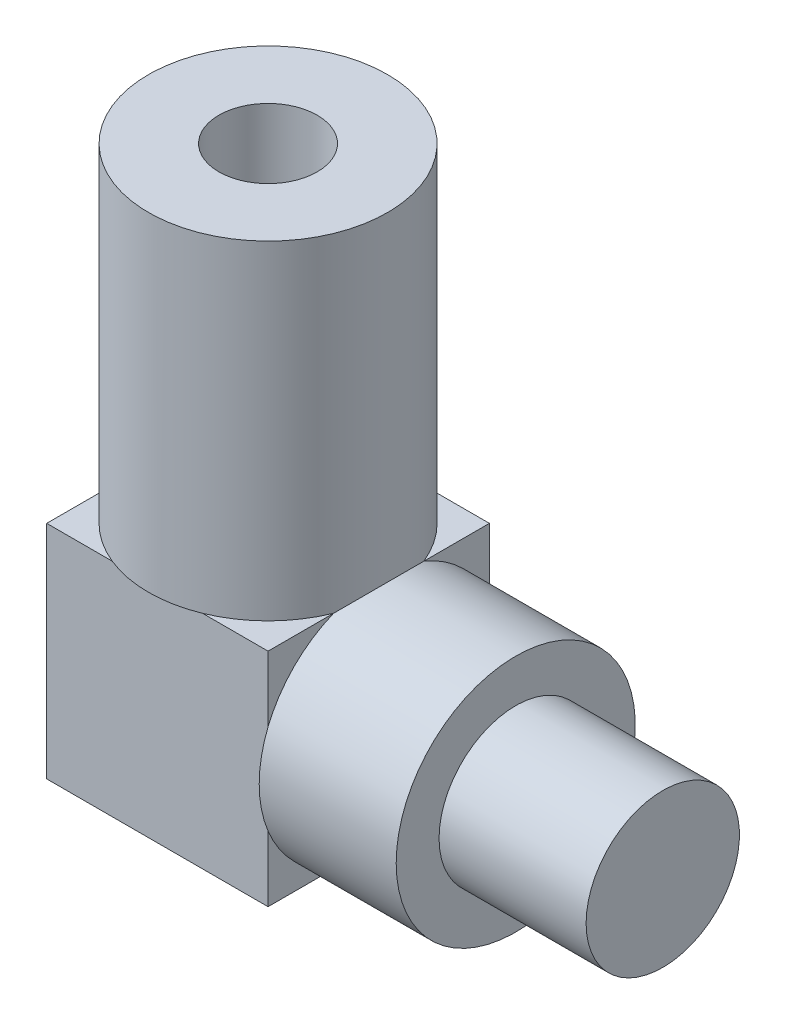
ISO-10303-21;
HEADER;
FILE_DESCRIPTION(('STEP AP214'),'2;1');
FILE_NAME('part.step','',(''),(''),'','','');
FILE_SCHEMA(('AUTOMOTIVE_DESIGN { 1 0 10303 214 1 1 1 1 }'));
ENDSEC;
DATA;
#1=APPLICATION_CONTEXT('core data for automotive mechanical design processes');
#2=APPLICATION_PROTOCOL_DEFINITION('international standard','automotive_design',2000,#1);
#3=PRODUCT_CONTEXT('',#1,'mechanical');
#4=PRODUCT('Part','Part','',(#3));
#5=PRODUCT_RELATED_PRODUCT_CATEGORY('part','',(#4));
#6=PRODUCT_DEFINITION_FORMATION('','',#4);
#7=PRODUCT_DEFINITION_CONTEXT('part definition',#1,'design');
#8=PRODUCT_DEFINITION('design','',#6,#7);
#9=PRODUCT_DEFINITION_SHAPE('','',#8);
#10=(LENGTH_UNIT() NAMED_UNIT(*) SI_UNIT(.MILLI.,.METRE.));
#11=(NAMED_UNIT(*) PLANE_ANGLE_UNIT() SI_UNIT($,.RADIAN.));
#12=(NAMED_UNIT(*) SI_UNIT($,.STERADIAN.) SOLID_ANGLE_UNIT());
#13=UNCERTAINTY_MEASURE_WITH_UNIT(LENGTH_MEASURE(1.E-05),#10,'distance_accuracy_value','');
#14=(GEOMETRIC_REPRESENTATION_CONTEXT(3) GLOBAL_UNCERTAINTY_ASSIGNED_CONTEXT((#13)) GLOBAL_UNIT_ASSIGNED_CONTEXT((#10,
#11,#12)) REPRESENTATION_CONTEXT('',''));
#15=CARTESIAN_POINT('',(0.,0.,0.));
#16=DIRECTION('',(0.,0.,1.));
#17=DIRECTION('',(1.,0.,0.));
#18=AXIS2_PLACEMENT_3D('',#15,#16,#17);
#19=CARTESIAN_POINT('',(-8.85,7.15,7.15));
#20=DIRECTION('',(0.,-1.,0.));
#21=DIRECTION('',(0.,0.,-1.));
#22=AXIS2_PLACEMENT_3D('',#19,#20,#21);
#23=PLANE('',#22);
#24=DIRECTION('',(-1.,0.,0.));
#25=VECTOR('',#24,1.);
#26=CARTESIAN_POINT('',(-8.85,7.15,-7.15));
#27=LINE('',#26,#25);
#28=CARTESIAN_POINT('',(-8.85,7.15,-7.15));
#29=VERTEX_POINT('',#28);
#30=CARTESIAN_POINT('',(-13.0833608382249,7.15,-7.15));
#31=VERTEX_POINT('',#30);
#32=EDGE_CURVE('E157',#29,#31,#27,.T.);
#33=ORIENTED_EDGE('',*,*,#32,.T.);
#34=CARTESIAN_POINT('',(-16.,7.15,0.));
#35=DIRECTION('',(0.,-1.,0.));
#36=DIRECTION('',(0.,0.,-1.));
#37=AXIS2_PLACEMENT_3D('',#34,#35,#36);
#38=CIRCLE('',#37,7.722);
#39=CARTESIAN_POINT('',(-8.85000000000001,7.15,-2.91663916177508));
#40=VERTEX_POINT('',#39);
#41=EDGE_CURVE('E148',#31,#40,#38,.T.);
#42=ORIENTED_EDGE('',*,*,#41,.T.);
#43=DIRECTION('',(0.,0.,-1.));
#44=VECTOR('',#43,1.);
#45=CARTESIAN_POINT('',(-8.85,7.15,7.15));
#46=LINE('',#45,#44);
#47=EDGE_CURVE('E163',#40,#29,#46,.T.);
#48=ORIENTED_EDGE('',*,*,#47,.T.);
#49=EDGE_LOOP('',(#33,#42,#48));
#50=FACE_BOUND('',#49,.T.);
#51=ADVANCED_FACE('F41',(#50),#23,.F.);
#52=CARTESIAN_POINT('',(-8.85,7.15,7.15));
#53=VERTEX_POINT('',#52);
#54=CARTESIAN_POINT('',(-8.85000000000002,7.15,2.91663916177508));
#55=VERTEX_POINT('',#54);
#56=EDGE_CURVE('E178',#53,#55,#46,.T.);
#57=ORIENTED_EDGE('',*,*,#56,.T.);
#58=CARTESIAN_POINT('',(-13.0833608382249,7.15,7.15));
#59=VERTEX_POINT('',#58);
#60=EDGE_CURVE('E155',#55,#59,#38,.T.);
#61=ORIENTED_EDGE('',*,*,#60,.T.);
#62=DIRECTION('',(-1.,0.,0.));
#63=VECTOR('',#62,1.);
#64=CARTESIAN_POINT('',(-8.85,7.15,7.15));
#65=LINE('',#64,#63);
#66=EDGE_CURVE('E273',#53,#59,#65,.T.);
#67=ORIENTED_EDGE('',*,*,#66,.F.);
#68=EDGE_LOOP('',(#57,#61,#67));
#69=FACE_BOUND('',#68,.T.);
#70=ADVANCED_FACE('F243',(#69),#23,.F.);
#71=CARTESIAN_POINT('',(-18.9166391617751,7.15,7.15));
#72=VERTEX_POINT('',#71);
#73=CARTESIAN_POINT('',(-23.15,7.15,7.15));
#74=VERTEX_POINT('',#73);
#75=EDGE_CURVE('E68',#72,#74,#65,.T.);
#76=ORIENTED_EDGE('',*,*,#75,.F.);
#77=CARTESIAN_POINT('',(-23.15,7.15,2.91663916177509));
#78=VERTEX_POINT('',#77);
#79=EDGE_CURVE('E275',#72,#78,#38,.T.);
#80=ORIENTED_EDGE('',*,*,#79,.T.);
#81=DIRECTION('',(0.,0.,-1.));
#82=VECTOR('',#81,1.);
#83=CARTESIAN_POINT('',(-23.15,7.15,7.15));
#84=LINE('',#83,#82);
#85=EDGE_CURVE('E171',#74,#78,#84,.T.);
#86=ORIENTED_EDGE('',*,*,#85,.F.);
#87=EDGE_LOOP('',(#76,#80,#86));
#88=FACE_BOUND('',#87,.T.);
#89=ADVANCED_FACE('F246',(#88),#23,.F.);
#90=CARTESIAN_POINT('',(-8.85,-7.15,7.15));
#91=DIRECTION('',(-1.,0.,0.));
#92=DIRECTION('',(0.,0.,1.));
#93=AXIS2_PLACEMENT_3D('',#90,#91,#92);
#94=PLANE('',#93);
#95=DIRECTION('',(0.,1.,0.));
#96=VECTOR('',#95,1.);
#97=CARTESIAN_POINT('',(-8.85,-7.15,7.15));
#98=LINE('',#97,#96);
#99=CARTESIAN_POINT('',(-8.85000000000002,2.91663916177508,7.15));
#100=VERTEX_POINT('',#99);
#101=EDGE_CURVE('E284',#100,#53,#98,.T.);
#102=ORIENTED_EDGE('',*,*,#101,.F.);
#103=CARTESIAN_POINT('',(-8.85000000000002,0.,0.));
#104=DIRECTION('',(-1.,0.,0.));
#105=DIRECTION('',(0.,0.,1.));
#106=AXIS2_PLACEMENT_3D('',#103,#104,#105);
#107=CIRCLE('',#106,7.722);
#108=EDGE_CURVE('E193',#100,#55,#107,.T.);
#109=ORIENTED_EDGE('',*,*,#108,.T.);
#110=ORIENTED_EDGE('',*,*,#56,.F.);
#111=EDGE_LOOP('',(#102,#109,#110));
#112=FACE_BOUND('',#111,.T.);
#113=ADVANCED_FACE('F263',(#112),#94,.F.);
#114=ORIENTED_EDGE('',*,*,#47,.F.);
#115=CARTESIAN_POINT('',(-8.85000000000002,2.91663916177508,-7.15));
#116=VERTEX_POINT('',#115);
#117=EDGE_CURVE('E49',#40,#116,#107,.T.);
#118=ORIENTED_EDGE('',*,*,#117,.T.);
#119=DIRECTION('',(0.,1.,0.));
#120=VECTOR('',#119,1.);
#121=CARTESIAN_POINT('',(-8.85,-7.15,-7.15));
#122=LINE('',#121,#120);
#123=EDGE_CURVE('E291',#116,#29,#122,.T.);
#124=ORIENTED_EDGE('',*,*,#123,.T.);
#125=EDGE_LOOP('',(#114,#118,#124));
#126=FACE_BOUND('',#125,.T.);
#127=ADVANCED_FACE('F269',(#126),#94,.F.);
#128=CARTESIAN_POINT('',(-8.85,-7.15,-7.15));
#129=VERTEX_POINT('',#128);
#130=CARTESIAN_POINT('',(-8.85000000000002,-2.91663916177508,-7.15));
#131=VERTEX_POINT('',#130);
#132=EDGE_CURVE('E166',#129,#131,#122,.T.);
#133=ORIENTED_EDGE('',*,*,#132,.T.);
#134=CARTESIAN_POINT('',(-8.85000000000002,-7.15,-2.91663916177508));
#135=VERTEX_POINT('',#134);
#136=EDGE_CURVE('E189',#131,#135,#107,.T.);
#137=ORIENTED_EDGE('',*,*,#136,.T.);
#138=DIRECTION('',(0.,0.,-1.));
#139=VECTOR('',#138,1.);
#140=CARTESIAN_POINT('',(-8.85,-7.15,7.15));
#141=LINE('',#140,#139);
#142=EDGE_CURVE('E179',#135,#129,#141,.T.);
#143=ORIENTED_EDGE('',*,*,#142,.T.);
#144=EDGE_LOOP('',(#133,#137,#143));
#145=FACE_BOUND('',#144,.T.);
#146=ADVANCED_FACE('F262',(#145),#94,.F.);
#147=CARTESIAN_POINT('',(-23.15,7.15,7.15));
#148=DIRECTION('',(1.,0.,0.));
#149=DIRECTION('',(0.,0.,-1.));
#150=AXIS2_PLACEMENT_3D('',#147,#148,#149);
#151=PLANE('',#150);
#152=DIRECTION('',(0.,-1.,0.));
#153=VECTOR('',#152,1.);
#154=CARTESIAN_POINT('',(-23.15,7.15,-7.15));
#155=LINE('',#154,#153);
#156=CARTESIAN_POINT('',(-23.15,7.15,-7.15));
#157=VERTEX_POINT('',#156);
#158=CARTESIAN_POINT('',(-23.15,-7.15,-7.15));
#159=VERTEX_POINT('',#158);
#160=EDGE_CURVE('E287',#157,#159,#155,.T.);
#161=ORIENTED_EDGE('',*,*,#160,.T.);
#162=DIRECTION('',(0.,0.,-1.));
#163=VECTOR('',#162,1.);
#164=CARTESIAN_POINT('',(-23.15,-7.15,7.15));
#165=LINE('',#164,#163);
#166=CARTESIAN_POINT('',(-23.15,-7.15,7.15));
#167=VERTEX_POINT('',#166);
#168=EDGE_CURVE('E181',#167,#159,#165,.T.);
#169=ORIENTED_EDGE('',*,*,#168,.F.);
#170=DIRECTION('',(0.,-1.,0.));
#171=VECTOR('',#170,1.);
#172=CARTESIAN_POINT('',(-23.15,7.15,7.15));
#173=LINE('',#172,#171);
#174=EDGE_CURVE('E167',#74,#167,#173,.T.);
#175=ORIENTED_EDGE('',*,*,#174,.F.);
#176=ORIENTED_EDGE('',*,*,#85,.T.);
#177=DIRECTION('',(0.,0.,-1.));
#178=VECTOR('',#177,1.);
#179=CARTESIAN_POINT('',(-23.15,7.15,7.15));
#180=LINE('',#179,#178);
#181=CARTESIAN_POINT('',(-23.15,7.15,-2.91663916177509));
#182=VERTEX_POINT('',#181);
#183=EDGE_CURVE('E208',#78,#182,#180,.T.);
#184=ORIENTED_EDGE('',*,*,#183,.T.);
#185=EDGE_CURVE('E90',#182,#157,#84,.T.);
#186=ORIENTED_EDGE('',*,*,#185,.T.);
#187=EDGE_LOOP('',(#161,#169,#175,#176,#184,#186));
#188=FACE_BOUND('',#187,.T.);
#189=ADVANCED_FACE('F43',(#188),#151,.F.);
#190=CARTESIAN_POINT('',(-23.15,-7.15,7.15));
#191=DIRECTION('',(0.,1.,0.));
#192=DIRECTION('',(0.,0.,1.));
#193=AXIS2_PLACEMENT_3D('',#190,#191,#192);
#194=PLANE('',#193);
#195=DIRECTION('',(1.,0.,0.));
#196=VECTOR('',#195,1.);
#197=CARTESIAN_POINT('',(-23.15,-7.15,-7.15));
#198=LINE('',#197,#196);
#199=EDGE_CURVE('E292',#159,#129,#198,.T.);
#200=ORIENTED_EDGE('',*,*,#199,.T.);
#201=ORIENTED_EDGE('',*,*,#142,.F.);
#202=CARTESIAN_POINT('',(-8.85000000000002,-7.15,2.91663916177508));
#203=VERTEX_POINT('',#202);
#204=EDGE_CURVE('E184',#203,#135,#141,.T.);
#205=ORIENTED_EDGE('',*,*,#204,.F.);
#206=CARTESIAN_POINT('',(-8.85,-7.15,7.15));
#207=VERTEX_POINT('',#206);
#208=EDGE_CURVE('E177',#207,#203,#141,.T.);
#209=ORIENTED_EDGE('',*,*,#208,.F.);
#210=DIRECTION('',(1.,0.,0.));
#211=VECTOR('',#210,1.);
#212=CARTESIAN_POINT('',(-23.15,-7.15,7.15));
#213=LINE('',#212,#211);
#214=EDGE_CURVE('E100',#167,#207,#213,.T.);
#215=ORIENTED_EDGE('',*,*,#214,.F.);
#216=ORIENTED_EDGE('',*,*,#168,.T.);
#217=EDGE_LOOP('',(#200,#201,#205,#209,#215,#216));
#218=FACE_BOUND('',#217,.T.);
#219=ADVANCED_FACE('F265',(#218),#194,.F.);
#220=ORIENTED_EDGE('',*,*,#208,.T.);
#221=CARTESIAN_POINT('',(-8.85000000000002,-2.91663916177508,7.15));
#222=VERTEX_POINT('',#221);
#223=EDGE_CURVE('E183',#203,#222,#107,.T.);
#224=ORIENTED_EDGE('',*,*,#223,.T.);
#225=EDGE_CURVE('E274',#207,#222,#98,.T.);
#226=ORIENTED_EDGE('',*,*,#225,.F.);
#227=EDGE_LOOP('',(#220,#224,#226));
#228=FACE_BOUND('',#227,.T.);
#229=ADVANCED_FACE('F255',(#228),#94,.F.);
#230=ORIENTED_EDGE('',*,*,#185,.F.);
#231=CARTESIAN_POINT('',(-18.9166391617751,7.15,-7.15));
#232=VERTEX_POINT('',#231);
#233=EDGE_CURVE('E141',#182,#232,#38,.T.);
#234=ORIENTED_EDGE('',*,*,#233,.T.);
#235=EDGE_CURVE('E159',#232,#157,#27,.T.);
#236=ORIENTED_EDGE('',*,*,#235,.T.);
#237=EDGE_LOOP('',(#230,#234,#236));
#238=FACE_BOUND('',#237,.T.);
#239=ADVANCED_FACE('F241',(#238),#23,.F.);
#240=CARTESIAN_POINT('',(0.,0.,7.15));
#241=DIRECTION('',(0.,0.,1.));
#242=DIRECTION('',(1.,0.,0.));
#243=AXIS2_PLACEMENT_3D('',#240,#241,#242);
#244=PLANE('',#243);
#245=ORIENTED_EDGE('',*,*,#174,.T.);
#246=ORIENTED_EDGE('',*,*,#214,.T.);
#247=ORIENTED_EDGE('',*,*,#225,.T.);
#248=EDGE_CURVE('E288',#222,#100,#98,.T.);
#249=ORIENTED_EDGE('',*,*,#248,.T.);
#250=ORIENTED_EDGE('',*,*,#101,.T.);
#251=ORIENTED_EDGE('',*,*,#66,.T.);
#252=DIRECTION('',(1.,0.,0.));
#253=VECTOR('',#252,1.);
#254=CARTESIAN_POINT('',(0.,7.15,7.15));
#255=LINE('',#254,#253);
#256=EDGE_CURVE('E161',#72,#59,#255,.T.);
#257=ORIENTED_EDGE('',*,*,#256,.F.);
#258=ORIENTED_EDGE('',*,*,#75,.T.);
#259=EDGE_LOOP('',(#245,#246,#247,#249,#250,#251,#257,#258));
#260=FACE_BOUND('',#259,.T.);
#261=ADVANCED_FACE('F251',(#260),#244,.T.);
#262=CARTESIAN_POINT('',(0.,0.,-7.15));
#263=DIRECTION('',(0.,0.,1.));
#264=DIRECTION('',(1.,0.,0.));
#265=AXIS2_PLACEMENT_3D('',#262,#263,#264);
#266=PLANE('',#265);
#267=ORIENTED_EDGE('',*,*,#160,.F.);
#268=ORIENTED_EDGE('',*,*,#235,.F.);
#269=DIRECTION('',(1.,0.,0.));
#270=VECTOR('',#269,1.);
#271=CARTESIAN_POINT('',(0.,7.15,-7.15));
#272=LINE('',#271,#270);
#273=EDGE_CURVE('E137',#232,#31,#272,.T.);
#274=ORIENTED_EDGE('',*,*,#273,.T.);
#275=ORIENTED_EDGE('',*,*,#32,.F.);
#276=ORIENTED_EDGE('',*,*,#123,.F.);
#277=EDGE_CURVE('E298',#131,#116,#122,.T.);
#278=ORIENTED_EDGE('',*,*,#277,.F.);
#279=ORIENTED_EDGE('',*,*,#132,.F.);
#280=ORIENTED_EDGE('',*,*,#199,.F.);
#281=EDGE_LOOP('',(#267,#268,#274,#275,#276,#278,#279,#280));
#282=FACE_BOUND('',#281,.T.);
#283=ADVANCED_FACE('F160',(#282),#266,.F.);
#284=CARTESIAN_POINT('',(-8.85,7.722,0.));
#285=DIRECTION('',(1.,0.,0.));
#286=DIRECTION('',(0.,0.,-1.));
#287=AXIS2_PLACEMENT_3D('',#284,#285,#286);
#288=PLANE('',#287);
#289=EDGE_CURVE('E199',#116,#131,#107,.T.);
#290=ORIENTED_EDGE('',*,*,#289,.T.);
#291=ORIENTED_EDGE('',*,*,#277,.T.);
#292=EDGE_LOOP('',(#290,#291));
#293=FACE_BOUND('',#292,.T.);
#294=ADVANCED_FACE('F304',(#293),#288,.F.);
#295=EDGE_CURVE('E210',#135,#203,#107,.T.);
#296=ORIENTED_EDGE('',*,*,#295,.T.);
#297=ORIENTED_EDGE('',*,*,#204,.T.);
#298=EDGE_LOOP('',(#296,#297));
#299=FACE_BOUND('',#298,.T.);
#300=ADVANCED_FACE('F317',(#299),#288,.F.);
#301=CARTESIAN_POINT('',(9.5,0.,0.));
#302=DIRECTION('',(-1.,0.,0.));
#303=DIRECTION('',(0.,0.,1.));
#304=AXIS2_PLACEMENT_3D('',#301,#302,#303);
#305=PLANE('',#304);
#306=CARTESIAN_POINT('',(9.50000000000006,0.,0.));
#307=DIRECTION('',(-1.,0.,0.));
#308=DIRECTION('',(0.,0.,1.));
#309=AXIS2_PLACEMENT_3D('',#306,#307,#308);
#310=CIRCLE('',#309,4.953);
#311=CARTESIAN_POINT('',(9.50000000000006,0.,4.953));
#312=VERTEX_POINT('',#311);
#313=EDGE_CURVE('E295',#312,#312,#310,.T.);
#314=ORIENTED_EDGE('',*,*,#313,.F.);
#315=EDGE_LOOP('',(#314));
#316=FACE_BOUND('',#315,.T.);
#317=ADVANCED_FACE('F321',(#316),#305,.F.);
#318=CARTESIAN_POINT('',(-1000.,0.,0.));
#319=DIRECTION('',(-1.,0.,0.));
#320=DIRECTION('',(0.,0.,1.));
#321=AXIS2_PLACEMENT_3D('',#318,#319,#320);
#322=CYLINDRICAL_SURFACE('',#321,4.953);
#323=CARTESIAN_POINT('',(0.,0.,0.));
#324=DIRECTION('',(-1.,0.,0.));
#325=DIRECTION('',(0.,0.,1.));
#326=AXIS2_PLACEMENT_3D('',#323,#324,#325);
#327=CIRCLE('',#326,4.953);
#328=CARTESIAN_POINT('',(0.,0.,4.953));
#329=VERTEX_POINT('',#328);
#330=EDGE_CURVE('E202',#329,#329,#327,.T.);
#331=ORIENTED_EDGE('',*,*,#330,.F.);
#332=EDGE_LOOP('',(#331));
#333=FACE_BOUND('',#332,.T.);
#334=ORIENTED_EDGE('',*,*,#313,.T.);
#335=EDGE_LOOP('',(#334));
#336=FACE_BOUND('',#335,.T.);
#337=ADVANCED_FACE('F327',(#333,#336),#322,.T.);
#338=CARTESIAN_POINT('',(0.,4.953,0.));
#339=DIRECTION('',(-1.,0.,0.));
#340=DIRECTION('',(0.,0.,1.));
#341=AXIS2_PLACEMENT_3D('',#338,#339,#340);
#342=PLANE('',#341);
#343=CARTESIAN_POINT('',(0.,0.,0.));
#344=DIRECTION('',(-1.,0.,0.));
#345=DIRECTION('',(0.,0.,1.));
#346=AXIS2_PLACEMENT_3D('',#343,#344,#345);
#347=CIRCLE('',#346,7.722);
#348=CARTESIAN_POINT('',(0.,0.,7.722));
#349=VERTEX_POINT('',#348);
#350=EDGE_CURVE('E200',#349,#349,#347,.T.);
#351=ORIENTED_EDGE('',*,*,#350,.F.);
#352=EDGE_LOOP('',(#351));
#353=FACE_BOUND('',#352,.T.);
#354=ORIENTED_EDGE('',*,*,#330,.T.);
#355=EDGE_LOOP('',(#354));
#356=FACE_BOUND('',#355,.T.);
#357=ADVANCED_FACE('F336',(#353,#356),#342,.F.);
#358=CARTESIAN_POINT('',(-1000.,0.,0.));
#359=DIRECTION('',(-1.,0.,0.));
#360=DIRECTION('',(0.,0.,1.));
#361=AXIS2_PLACEMENT_3D('',#358,#359,#360);
#362=CYLINDRICAL_SURFACE('',#361,7.722);
#363=ORIENTED_EDGE('',*,*,#117,.F.);
#364=CARTESIAN_POINT('',(-16.,0.,0.));
#365=DIRECTION('',(-0.707106781186547,0.707106781186547,0.));
#366=DIRECTION('',(-0.707106781186547,-0.707106781186547,0.));
#367=AXIS2_PLACEMENT_3D('',#364,#365,#366);
#368=ELLIPSE('',#367,10.920557128645,7.722);
#369=EDGE_CURVE('E11',#40,#55,#368,.F.);
#370=ORIENTED_EDGE('',*,*,#369,.T.);
#371=ORIENTED_EDGE('',*,*,#108,.F.);
#372=EDGE_CURVE('E60',#222,#100,#107,.T.);
#373=ORIENTED_EDGE('',*,*,#372,.F.);
#374=ORIENTED_EDGE('',*,*,#223,.F.);
#375=ORIENTED_EDGE('',*,*,#295,.F.);
#376=ORIENTED_EDGE('',*,*,#136,.F.);
#377=ORIENTED_EDGE('',*,*,#289,.F.);
#378=EDGE_LOOP('',(#363,#370,#371,#373,#374,#375,#376,#377));
#379=FACE_BOUND('',#378,.T.);
#380=ORIENTED_EDGE('',*,*,#350,.T.);
#381=EDGE_LOOP('',(#380));
#382=FACE_BOUND('',#381,.T.);
#383=ADVANCED_FACE('F302',(#379,#382),#362,.T.);
#384=ORIENTED_EDGE('',*,*,#248,.F.);
#385=ORIENTED_EDGE('',*,*,#372,.T.);
#386=EDGE_LOOP('',(#384,#385));
#387=FACE_BOUND('',#386,.T.);
#388=ADVANCED_FACE('F323',(#387),#288,.F.);
#389=CARTESIAN_POINT('',(-16.,7.15,0.));
#390=DIRECTION('',(0.,-1.,0.));
#391=DIRECTION('',(0.,0.,-1.));
#392=AXIS2_PLACEMENT_3D('',#389,#390,#391);
#393=PLANE('',#392);
#394=ORIENTED_EDGE('',*,*,#183,.F.);
#395=EDGE_CURVE('E496',#78,#182,#38,.T.);
#396=ORIENTED_EDGE('',*,*,#395,.T.);
#397=EDGE_LOOP('',(#394,#396));
#398=FACE_BOUND('',#397,.T.);
#399=ADVANCED_FACE('F239',(#398),#393,.T.);
#400=ORIENTED_EDGE('',*,*,#273,.F.);
#401=EDGE_CURVE('E138',#232,#31,#38,.T.);
#402=ORIENTED_EDGE('',*,*,#401,.T.);
#403=EDGE_LOOP('',(#400,#402));
#404=FACE_BOUND('',#403,.T.);
#405=ADVANCED_FACE('F136',(#404),#393,.T.);
#406=EDGE_CURVE('E283',#59,#72,#38,.T.);
#407=ORIENTED_EDGE('',*,*,#406,.T.);
#408=ORIENTED_EDGE('',*,*,#256,.T.);
#409=EDGE_LOOP('',(#407,#408));
#410=FACE_BOUND('',#409,.T.);
#411=ADVANCED_FACE('F235',(#410),#393,.T.);
#412=CARTESIAN_POINT('',(-16.,0.,0.));
#413=DIRECTION('',(0.,-1.,0.));
#414=DIRECTION('',(0.,0.,-1.));
#415=AXIS2_PLACEMENT_3D('',#412,#413,#414);
#416=CYLINDRICAL_SURFACE('',#415,7.722);
#417=CARTESIAN_POINT('',(-16.,28.4,0.));
#418=DIRECTION('',(0.,-1.,0.));
#419=DIRECTION('',(0.,0.,-1.));
#420=AXIS2_PLACEMENT_3D('',#417,#418,#419);
#421=CIRCLE('',#420,7.722);
#422=CARTESIAN_POINT('',(-16.,28.4,-7.722));
#423=VERTEX_POINT('',#422);
#424=EDGE_CURVE('E145',#423,#423,#421,.T.);
#425=ORIENTED_EDGE('',*,*,#424,.T.);
#426=EDGE_LOOP('',(#425));
#427=FACE_BOUND('',#426,.T.);
#428=ORIENTED_EDGE('',*,*,#369,.F.);
#429=ORIENTED_EDGE('',*,*,#41,.F.);
#430=ORIENTED_EDGE('',*,*,#401,.F.);
#431=ORIENTED_EDGE('',*,*,#233,.F.);
#432=ORIENTED_EDGE('',*,*,#395,.F.);
#433=ORIENTED_EDGE('',*,*,#79,.F.);
#434=ORIENTED_EDGE('',*,*,#406,.F.);
#435=ORIENTED_EDGE('',*,*,#60,.F.);
#436=EDGE_LOOP('',(#428,#429,#430,#431,#432,#433,#434,#435));
#437=FACE_BOUND('',#436,.T.);
#438=ADVANCED_FACE('F146',(#427,#437),#416,.T.);
#439=CARTESIAN_POINT('',(-8.278,28.4,0.));
#440=DIRECTION('',(0.,1.,0.));
#441=DIRECTION('',(0.,0.,1.));
#442=AXIS2_PLACEMENT_3D('',#439,#440,#441);
#443=PLANE('',#442);
#444=CARTESIAN_POINT('',(-16.,28.4,0.));
#445=DIRECTION('',(0.,1.,0.));
#446=DIRECTION('',(0.,0.,1.));
#447=AXIS2_PLACEMENT_3D('',#444,#445,#446);
#448=CIRCLE('',#447,3.175);
#449=CARTESIAN_POINT('',(-16.,28.4,3.175));
#450=VERTEX_POINT('',#449);
#451=EDGE_CURVE('E44',#450,#450,#448,.T.);
#452=ORIENTED_EDGE('',*,*,#451,.F.);
#453=EDGE_LOOP('',(#452));
#454=FACE_BOUND('',#453,.T.);
#455=ORIENTED_EDGE('',*,*,#424,.F.);
#456=EDGE_LOOP('',(#455));
#457=FACE_BOUND('',#456,.T.);
#458=ADVANCED_FACE('F221',(#454,#457),#443,.T.);
#459=CARTESIAN_POINT('',(-16.,13.2,0.));
#460=DIRECTION('',(0.,-1.,0.));
#461=DIRECTION('',(0.,0.,-1.));
#462=AXIS2_PLACEMENT_3D('',#459,#460,#461);
#463=PLANE('',#462);
#464=CARTESIAN_POINT('',(-16.,13.2,0.));
#465=DIRECTION('',(0.,-1.,0.));
#466=DIRECTION('',(0.,0.,-1.));
#467=AXIS2_PLACEMENT_3D('',#464,#465,#466);
#468=CIRCLE('',#467,3.175);
#469=CARTESIAN_POINT('',(-16.,13.2,-3.175));
#470=VERTEX_POINT('',#469);
#471=EDGE_CURVE('E214',#470,#470,#468,.T.);
#472=ORIENTED_EDGE('',*,*,#471,.F.);
#473=EDGE_LOOP('',(#472));
#474=FACE_BOUND('',#473,.T.);
#475=ADVANCED_FACE('F230',(#474),#463,.F.);
#476=CARTESIAN_POINT('',(-16.,0.,0.));
#477=DIRECTION('',(0.,-1.,0.));
#478=DIRECTION('',(0.,0.,-1.));
#479=AXIS2_PLACEMENT_3D('',#476,#477,#478);
#480=CYLINDRICAL_SURFACE('',#479,3.175);
#481=ORIENTED_EDGE('',*,*,#451,.T.);
#482=EDGE_LOOP('',(#481));
#483=FACE_BOUND('',#482,.T.);
#484=ORIENTED_EDGE('',*,*,#471,.T.);
#485=EDGE_LOOP('',(#484));
#486=FACE_BOUND('',#485,.T.);
#487=ADVANCED_FACE('F225',(#483,#486),#480,.F.);
#488=CLOSED_SHELL('',(#51,#70,#89,#113,#127,#146,#189,#219,#229,#239,#261,#283,#294,#300,#317,
#337,#357,#383,#388,#399,#405,#411,#438,#458,#475,#487));
#489=MANIFOLD_SOLID_BREP('B2',#488);
#490=ADVANCED_BREP_SHAPE_REPRESENTATION('',(#18,#489),#14);
#491=SHAPE_DEFINITION_REPRESENTATION(#9,#490);
ENDSEC;
END-ISO-10303-21;
